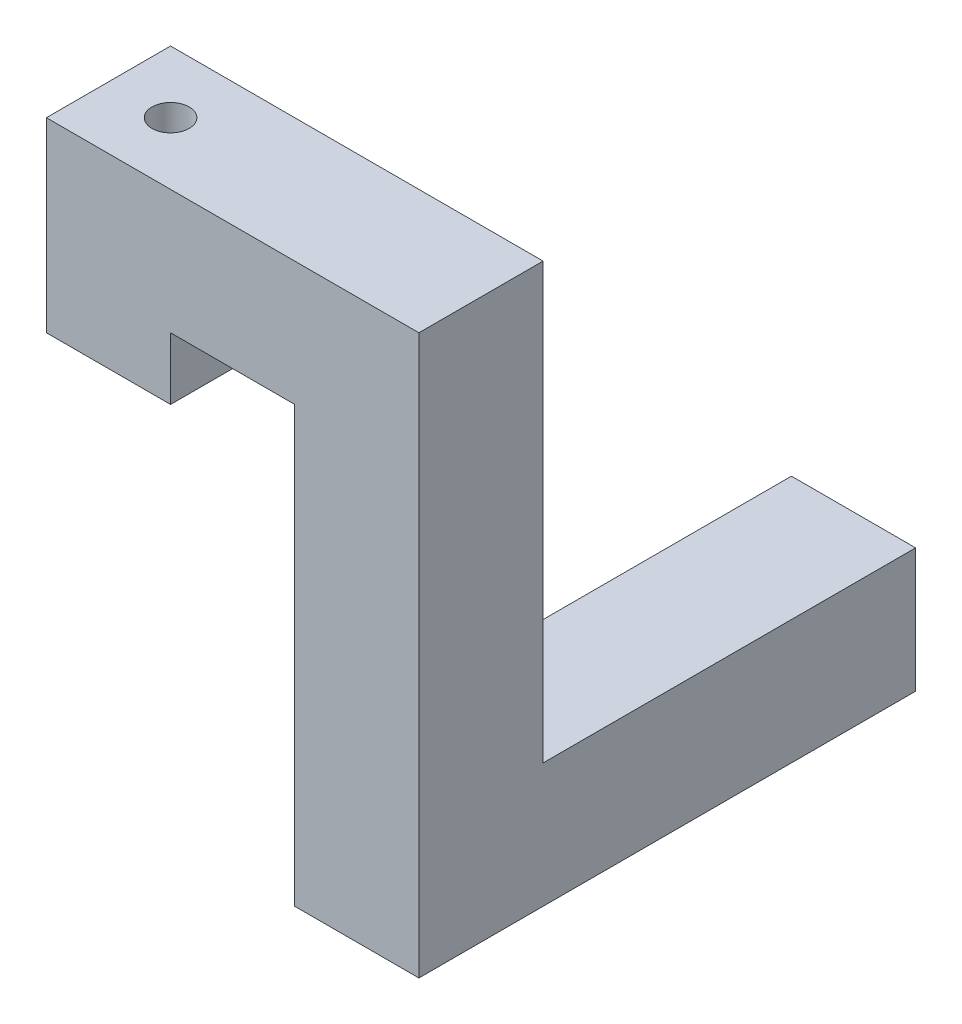
ISO-10303-21;
HEADER;
FILE_DESCRIPTION(('STEP AP214'),'2;1');
FILE_NAME('part.step','',(''),(''),'','','');
FILE_SCHEMA(('AUTOMOTIVE_DESIGN { 1 0 10303 214 1 1 1 1 }'));
ENDSEC;
DATA;
#1=APPLICATION_CONTEXT('core data for automotive mechanical design processes');
#2=APPLICATION_PROTOCOL_DEFINITION('international standard','automotive_design',2000,#1);
#3=PRODUCT_CONTEXT('',#1,'mechanical');
#4=PRODUCT('Part','Part','',(#3));
#5=PRODUCT_RELATED_PRODUCT_CATEGORY('part','',(#4));
#6=PRODUCT_DEFINITION_FORMATION('','',#4);
#7=PRODUCT_DEFINITION_CONTEXT('part definition',#1,'design');
#8=PRODUCT_DEFINITION('design','',#6,#7);
#9=PRODUCT_DEFINITION_SHAPE('','',#8);
#10=(LENGTH_UNIT() NAMED_UNIT(*) SI_UNIT(.MILLI.,.METRE.));
#11=(NAMED_UNIT(*) PLANE_ANGLE_UNIT() SI_UNIT($,.RADIAN.));
#12=(NAMED_UNIT(*) SI_UNIT($,.STERADIAN.) SOLID_ANGLE_UNIT());
#13=UNCERTAINTY_MEASURE_WITH_UNIT(LENGTH_MEASURE(1.E-05),#10,'distance_accuracy_value','');
#14=(GEOMETRIC_REPRESENTATION_CONTEXT(3) GLOBAL_UNCERTAINTY_ASSIGNED_CONTEXT((#13)) GLOBAL_UNIT_ASSIGNED_CONTEXT((#10,
#11,#12)) REPRESENTATION_CONTEXT('',''));
#15=CARTESIAN_POINT('',(0.,0.,0.));
#16=DIRECTION('',(0.,0.,1.));
#17=DIRECTION('',(1.,0.,0.));
#18=AXIS2_PLACEMENT_3D('',#15,#16,#17);
#19=CARTESIAN_POINT('',(-10.,30.,-9.99999999999999));
#20=DIRECTION('',(0.,0.,1.));
#21=DIRECTION('',(1.,0.,0.));
#22=AXIS2_PLACEMENT_3D('',#19,#20,#21);
#23=PLANE('',#22);
#24=DIRECTION('',(1.,0.,0.));
#25=VECTOR('',#24,1.);
#26=CARTESIAN_POINT('',(30.,-40.,-9.99999999999999));
#27=LINE('',#26,#25);
#28=CARTESIAN_POINT('',(30.,-40.,-9.99999999999999));
#29=VERTEX_POINT('',#28);
#30=CARTESIAN_POINT('',(50.,-40.,-9.99999999999999));
#31=VERTEX_POINT('',#30);
#32=EDGE_CURVE('E55',#29,#31,#27,.T.);
#33=ORIENTED_EDGE('',*,*,#32,.F.);
#34=DIRECTION('',(0.,1.,0.));
#35=VECTOR('',#34,1.);
#36=CARTESIAN_POINT('',(30.,-60.,-9.99999999999999));
#37=LINE('',#36,#35);
#38=CARTESIAN_POINT('',(30.,10.,-9.99999999999999));
#39=VERTEX_POINT('',#38);
#40=EDGE_CURVE('E143',#29,#39,#37,.T.);
#41=ORIENTED_EDGE('',*,*,#40,.T.);
#42=DIRECTION('',(-1.,0.,0.));
#43=VECTOR('',#42,1.);
#44=CARTESIAN_POINT('',(50.,10.,-9.99999999999999));
#45=LINE('',#44,#43);
#46=CARTESIAN_POINT('',(9.99999999999999,10.,-9.99999999999999));
#47=VERTEX_POINT('',#46);
#48=EDGE_CURVE('E182',#39,#47,#45,.T.);
#49=ORIENTED_EDGE('',*,*,#48,.T.);
#50=DIRECTION('',(0.,-1.,0.));
#51=VECTOR('',#50,1.);
#52=CARTESIAN_POINT('',(9.99999999999999,30.,-9.99999999999999));
#53=LINE('',#52,#51);
#54=CARTESIAN_POINT('',(9.99999999999999,0.,-9.99999999999999));
#55=VERTEX_POINT('',#54);
#56=EDGE_CURVE('E11',#47,#55,#53,.T.);
#57=ORIENTED_EDGE('',*,*,#56,.T.);
#58=DIRECTION('',(-1.,0.,0.));
#59=VECTOR('',#58,1.);
#60=CARTESIAN_POINT('',(-10.,0.,-9.99999999999999));
#61=LINE('',#60,#59);
#62=CARTESIAN_POINT('',(-10.,0.,-9.99999999999999));
#63=VERTEX_POINT('',#62);
#64=EDGE_CURVE('E200',#55,#63,#61,.T.);
#65=ORIENTED_EDGE('',*,*,#64,.T.);
#66=DIRECTION('',(0.,-1.,0.));
#67=VECTOR('',#66,1.);
#68=CARTESIAN_POINT('',(-10.,30.,-9.99999999999999));
#69=LINE('',#68,#67);
#70=CARTESIAN_POINT('',(-10.,30.,-9.99999999999999));
#71=VERTEX_POINT('',#70);
#72=EDGE_CURVE('E48',#71,#63,#69,.T.);
#73=ORIENTED_EDGE('',*,*,#72,.F.);
#74=DIRECTION('',(-1.,0.,0.));
#75=VECTOR('',#74,1.);
#76=CARTESIAN_POINT('',(-10.,30.,-9.99999999999999));
#77=LINE('',#76,#75);
#78=CARTESIAN_POINT('',(50.,30.,-9.99999999999999));
#79=VERTEX_POINT('',#78);
#80=EDGE_CURVE('E186',#79,#71,#77,.T.);
#81=ORIENTED_EDGE('',*,*,#80,.F.);
#82=DIRECTION('',(0.,-1.,0.));
#83=VECTOR('',#82,1.);
#84=CARTESIAN_POINT('',(50.,30.,-9.99999999999999));
#85=LINE('',#84,#83);
#86=EDGE_CURVE('E168',#79,#31,#85,.T.);
#87=ORIENTED_EDGE('',*,*,#86,.T.);
#88=EDGE_LOOP('',(#33,#41,#49,#57,#65,#73,#81,#87));
#89=FACE_BOUND('',#88,.T.);
#90=ADVANCED_FACE('F39',(#89),#23,.F.);
#91=CARTESIAN_POINT('',(50.,10.,10.));
#92=DIRECTION('',(0.,1.,0.));
#93=DIRECTION('',(0.,0.,1.));
#94=AXIS2_PLACEMENT_3D('',#91,#92,#93);
#95=PLANE('',#94);
#96=DIRECTION('',(0.,0.,-1.));
#97=VECTOR('',#96,1.);
#98=CARTESIAN_POINT('',(30.,10.,10.));
#99=LINE('',#98,#97);
#100=CARTESIAN_POINT('',(30.,10.,10.));
#101=VERTEX_POINT('',#100);
#102=EDGE_CURVE('E145',#101,#39,#99,.T.);
#103=ORIENTED_EDGE('',*,*,#102,.F.);
#104=DIRECTION('',(-1.,0.,0.));
#105=VECTOR('',#104,1.);
#106=CARTESIAN_POINT('',(50.,10.,10.));
#107=LINE('',#106,#105);
#108=CARTESIAN_POINT('',(10.,10.,10.));
#109=VERTEX_POINT('',#108);
#110=EDGE_CURVE('E63',#101,#109,#107,.T.);
#111=ORIENTED_EDGE('',*,*,#110,.T.);
#112=DIRECTION('',(0.,0.,-1.));
#113=VECTOR('',#112,1.);
#114=CARTESIAN_POINT('',(10.,10.,10.));
#115=LINE('',#114,#113);
#116=EDGE_CURVE('E165',#109,#47,#115,.T.);
#117=ORIENTED_EDGE('',*,*,#116,.T.);
#118=ORIENTED_EDGE('',*,*,#48,.F.);
#119=EDGE_LOOP('',(#103,#111,#117,#118));
#120=FACE_BOUND('',#119,.T.);
#121=ADVANCED_FACE('F270',(#120),#95,.F.);
#122=CARTESIAN_POINT('',(9.99999999999999,30.,-9.99999999999999));
#123=DIRECTION('',(-1.,0.,0.));
#124=DIRECTION('',(0.,0.,1.));
#125=AXIS2_PLACEMENT_3D('',#122,#123,#124);
#126=PLANE('',#125);
#127=ORIENTED_EDGE('',*,*,#116,.F.);
#128=DIRECTION('',(0.,-1.,0.));
#129=VECTOR('',#128,1.);
#130=CARTESIAN_POINT('',(10.,30.,10.));
#131=LINE('',#130,#129);
#132=CARTESIAN_POINT('',(10.,0.,10.));
#133=VERTEX_POINT('',#132);
#134=EDGE_CURVE('E196',#109,#133,#131,.T.);
#135=ORIENTED_EDGE('',*,*,#134,.T.);
#136=DIRECTION('',(0.,0.,-1.));
#137=VECTOR('',#136,1.);
#138=CARTESIAN_POINT('',(9.99999999999999,0.,-9.99999999999999));
#139=LINE('',#138,#137);
#140=EDGE_CURVE('E185',#133,#55,#139,.T.);
#141=ORIENTED_EDGE('',*,*,#140,.T.);
#142=ORIENTED_EDGE('',*,*,#56,.F.);
#143=EDGE_LOOP('',(#127,#135,#141,#142));
#144=FACE_BOUND('',#143,.T.);
#145=ADVANCED_FACE('F41',(#144),#126,.F.);
#146=CARTESIAN_POINT('',(-10.,30.,-9.99999999999999));
#147=DIRECTION('',(1.,0.,0.));
#148=DIRECTION('',(0.,0.,-1.));
#149=AXIS2_PLACEMENT_3D('',#146,#147,#148);
#150=PLANE('',#149);
#151=DIRECTION('',(0.,0.,1.));
#152=VECTOR('',#151,1.);
#153=CARTESIAN_POINT('',(-10.,0.,-9.99999999999999));
#154=LINE('',#153,#152);
#155=CARTESIAN_POINT('',(-10.,0.,10.));
#156=VERTEX_POINT('',#155);
#157=EDGE_CURVE('E203',#63,#156,#154,.T.);
#158=ORIENTED_EDGE('',*,*,#157,.T.);
#159=DIRECTION('',(0.,-1.,0.));
#160=VECTOR('',#159,1.);
#161=CARTESIAN_POINT('',(-10.,30.,10.));
#162=LINE('',#161,#160);
#163=CARTESIAN_POINT('',(-10.,30.,10.));
#164=VERTEX_POINT('',#163);
#165=EDGE_CURVE('E211',#164,#156,#162,.T.);
#166=ORIENTED_EDGE('',*,*,#165,.F.);
#167=DIRECTION('',(0.,0.,1.));
#168=VECTOR('',#167,1.);
#169=CARTESIAN_POINT('',(-10.,30.,-9.99999999999999));
#170=LINE('',#169,#168);
#171=EDGE_CURVE('E189',#71,#164,#170,.T.);
#172=ORIENTED_EDGE('',*,*,#171,.F.);
#173=ORIENTED_EDGE('',*,*,#72,.T.);
#174=EDGE_LOOP('',(#158,#166,#172,#173));
#175=FACE_BOUND('',#174,.T.);
#176=ADVANCED_FACE('F220',(#175),#150,.F.);
#177=CARTESIAN_POINT('',(-10.,30.,10.));
#178=DIRECTION('',(0.,0.,-1.));
#179=DIRECTION('',(-1.,0.,0.));
#180=AXIS2_PLACEMENT_3D('',#177,#178,#179);
#181=PLANE('',#180);
#182=DIRECTION('',(1.,0.,0.));
#183=VECTOR('',#182,1.);
#184=CARTESIAN_POINT('',(-10.,0.,10.));
#185=LINE('',#184,#183);
#186=EDGE_CURVE('E190',#156,#133,#185,.T.);
#187=ORIENTED_EDGE('',*,*,#186,.T.);
#188=ORIENTED_EDGE('',*,*,#134,.F.);
#189=ORIENTED_EDGE('',*,*,#110,.F.);
#190=DIRECTION('',(0.,1.,0.));
#191=VECTOR('',#190,1.);
#192=CARTESIAN_POINT('',(30.,-60.,10.));
#193=LINE('',#192,#191);
#194=CARTESIAN_POINT('',(30.,-60.,10.));
#195=VERTEX_POINT('',#194);
#196=EDGE_CURVE('E162',#195,#101,#193,.T.);
#197=ORIENTED_EDGE('',*,*,#196,.F.);
#198=DIRECTION('',(-1.,0.,0.));
#199=VECTOR('',#198,1.);
#200=CARTESIAN_POINT('',(50.,-60.,10.));
#201=LINE('',#200,#199);
#202=CARTESIAN_POINT('',(50.,-60.,10.));
#203=VERTEX_POINT('',#202);
#204=EDGE_CURVE('E156',#203,#195,#201,.T.);
#205=ORIENTED_EDGE('',*,*,#204,.F.);
#206=DIRECTION('',(0.,-1.,0.));
#207=VECTOR('',#206,1.);
#208=CARTESIAN_POINT('',(50.,30.,10.));
#209=LINE('',#208,#207);
#210=CARTESIAN_POINT('',(50.,30.,10.));
#211=VERTEX_POINT('',#210);
#212=EDGE_CURVE('E175',#211,#203,#209,.T.);
#213=ORIENTED_EDGE('',*,*,#212,.F.);
#214=DIRECTION('',(1.,0.,0.));
#215=VECTOR('',#214,1.);
#216=CARTESIAN_POINT('',(-10.,30.,10.));
#217=LINE('',#216,#215);
#218=EDGE_CURVE('E193',#164,#211,#217,.T.);
#219=ORIENTED_EDGE('',*,*,#218,.F.);
#220=ORIENTED_EDGE('',*,*,#165,.T.);
#221=EDGE_LOOP('',(#187,#188,#189,#197,#205,#213,#219,#220));
#222=FACE_BOUND('',#221,.T.);
#223=ADVANCED_FACE('F229',(#222),#181,.F.);
#224=CARTESIAN_POINT('',(0.,30.,0.));
#225=DIRECTION('',(0.,1.,0.));
#226=DIRECTION('',(0.,0.,1.));
#227=AXIS2_PLACEMENT_3D('',#224,#225,#226);
#228=PLANE('',#227);
#229=CARTESIAN_POINT('',(0.,30.,0.));
#230=DIRECTION('',(0.,1.,0.));
#231=DIRECTION('',(0.,0.,1.));
#232=AXIS2_PLACEMENT_3D('',#229,#230,#231);
#233=CIRCLE('',#232,3.);
#234=CARTESIAN_POINT('',(0.,30.,3.));
#235=VERTEX_POINT('',#234);
#236=EDGE_CURVE('E245',#235,#235,#233,.T.);
#237=ORIENTED_EDGE('',*,*,#236,.F.);
#238=EDGE_LOOP('',(#237));
#239=FACE_BOUND('',#238,.T.);
#240=ORIENTED_EDGE('',*,*,#218,.T.);
#241=DIRECTION('',(0.,0.,-1.));
#242=VECTOR('',#241,1.);
#243=CARTESIAN_POINT('',(50.,30.,10.));
#244=LINE('',#243,#242);
#245=EDGE_CURVE('E171',#211,#79,#244,.T.);
#246=ORIENTED_EDGE('',*,*,#245,.T.);
#247=ORIENTED_EDGE('',*,*,#80,.T.);
#248=ORIENTED_EDGE('',*,*,#171,.T.);
#249=EDGE_LOOP('',(#240,#246,#247,#248));
#250=FACE_BOUND('',#249,.T.);
#251=ADVANCED_FACE('F235',(#239,#250),#228,.T.);
#252=CARTESIAN_POINT('',(0.,0.,0.));
#253=DIRECTION('',(0.,1.,0.));
#254=DIRECTION('',(0.,0.,1.));
#255=AXIS2_PLACEMENT_3D('',#252,#253,#254);
#256=PLANE('',#255);
#257=CARTESIAN_POINT('',(0.,0.,0.));
#258=DIRECTION('',(0.,-1.,0.));
#259=DIRECTION('',(0.,0.,-1.));
#260=AXIS2_PLACEMENT_3D('',#257,#258,#259);
#261=CIRCLE('',#260,3.);
#262=CARTESIAN_POINT('',(0.,0.,-3.));
#263=VERTEX_POINT('',#262);
#264=EDGE_CURVE('E248',#263,#263,#261,.T.);
#265=ORIENTED_EDGE('',*,*,#264,.F.);
#266=EDGE_LOOP('',(#265));
#267=FACE_BOUND('',#266,.T.);
#268=ORIENTED_EDGE('',*,*,#140,.F.);
#269=ORIENTED_EDGE('',*,*,#186,.F.);
#270=ORIENTED_EDGE('',*,*,#157,.F.);
#271=ORIENTED_EDGE('',*,*,#64,.F.);
#272=EDGE_LOOP('',(#268,#269,#270,#271));
#273=FACE_BOUND('',#272,.T.);
#274=ADVANCED_FACE('F226',(#267,#273),#256,.F.);
#275=CARTESIAN_POINT('',(50.,0.,0.));
#276=DIRECTION('',(-1.,0.,0.));
#277=DIRECTION('',(0.,0.,1.));
#278=AXIS2_PLACEMENT_3D('',#275,#276,#277);
#279=PLANE('',#278);
#280=ORIENTED_EDGE('',*,*,#212,.T.);
#281=DIRECTION('',(0.,0.,-1.));
#282=VECTOR('',#281,1.);
#283=CARTESIAN_POINT('',(50.,-60.,10.));
#284=LINE('',#283,#282);
#285=CARTESIAN_POINT('',(50.,-60.,-70.));
#286=VERTEX_POINT('',#285);
#287=EDGE_CURVE('E159',#203,#286,#284,.T.);
#288=ORIENTED_EDGE('',*,*,#287,.T.);
#289=DIRECTION('',(0.,-1.,0.));
#290=VECTOR('',#289,1.);
#291=CARTESIAN_POINT('',(50.,-60.,-70.));
#292=LINE('',#291,#290);
#293=CARTESIAN_POINT('',(50.,-40.,-70.));
#294=VERTEX_POINT('',#293);
#295=EDGE_CURVE('E129',#294,#286,#292,.T.);
#296=ORIENTED_EDGE('',*,*,#295,.F.);
#297=DIRECTION('',(0.,0.,1.));
#298=VECTOR('',#297,1.);
#299=CARTESIAN_POINT('',(50.,-40.,-70.));
#300=LINE('',#299,#298);
#301=EDGE_CURVE('E124',#294,#31,#300,.T.);
#302=ORIENTED_EDGE('',*,*,#301,.T.);
#303=ORIENTED_EDGE('',*,*,#86,.F.);
#304=ORIENTED_EDGE('',*,*,#245,.F.);
#305=EDGE_LOOP('',(#280,#288,#296,#302,#303,#304));
#306=FACE_BOUND('',#305,.T.);
#307=ADVANCED_FACE('F238',(#306),#279,.F.);
#308=CARTESIAN_POINT('',(30.,-60.,10.));
#309=DIRECTION('',(1.,0.,0.));
#310=DIRECTION('',(0.,0.,-1.));
#311=AXIS2_PLACEMENT_3D('',#308,#309,#310);
#312=PLANE('',#311);
#313=ORIENTED_EDGE('',*,*,#102,.T.);
#314=ORIENTED_EDGE('',*,*,#40,.F.);
#315=DIRECTION('',(0.,0.,1.));
#316=VECTOR('',#315,1.);
#317=CARTESIAN_POINT('',(30.,-40.,-70.));
#318=LINE('',#317,#316);
#319=CARTESIAN_POINT('',(30.,-40.,-70.));
#320=VERTEX_POINT('',#319);
#321=EDGE_CURVE('E122',#320,#29,#318,.T.);
#322=ORIENTED_EDGE('',*,*,#321,.F.);
#323=DIRECTION('',(0.,1.,0.));
#324=VECTOR('',#323,1.);
#325=CARTESIAN_POINT('',(30.,-60.,-70.));
#326=LINE('',#325,#324);
#327=CARTESIAN_POINT('',(30.,-60.,-70.));
#328=VERTEX_POINT('',#327);
#329=EDGE_CURVE('E130',#328,#320,#326,.T.);
#330=ORIENTED_EDGE('',*,*,#329,.F.);
#331=DIRECTION('',(0.,0.,-1.));
#332=VECTOR('',#331,1.);
#333=CARTESIAN_POINT('',(30.,-60.,10.));
#334=LINE('',#333,#332);
#335=EDGE_CURVE('E149',#195,#328,#334,.T.);
#336=ORIENTED_EDGE('',*,*,#335,.F.);
#337=ORIENTED_EDGE('',*,*,#196,.T.);
#338=EDGE_LOOP('',(#313,#314,#322,#330,#336,#337));
#339=FACE_BOUND('',#338,.T.);
#340=ADVANCED_FACE('F142',(#339),#312,.F.);
#341=CARTESIAN_POINT('',(0.,-60.,0.));
#342=DIRECTION('',(0.,-1.,0.));
#343=DIRECTION('',(0.,0.,-1.));
#344=AXIS2_PLACEMENT_3D('',#341,#342,#343);
#345=PLANE('',#344);
#346=ORIENTED_EDGE('',*,*,#335,.T.);
#347=DIRECTION('',(-1.,0.,0.));
#348=VECTOR('',#347,1.);
#349=CARTESIAN_POINT('',(30.,-60.,-70.));
#350=LINE('',#349,#348);
#351=EDGE_CURVE('E136',#286,#328,#350,.T.);
#352=ORIENTED_EDGE('',*,*,#351,.F.);
#353=ORIENTED_EDGE('',*,*,#287,.F.);
#354=ORIENTED_EDGE('',*,*,#204,.T.);
#355=EDGE_LOOP('',(#346,#352,#353,#354));
#356=FACE_BOUND('',#355,.T.);
#357=ADVANCED_FACE('F318',(#356),#345,.T.);
#358=CARTESIAN_POINT('',(30.,-40.,-70.));
#359=DIRECTION('',(0.,-1.,0.));
#360=DIRECTION('',(0.,0.,-1.));
#361=AXIS2_PLACEMENT_3D('',#358,#359,#360);
#362=PLANE('',#361);
#363=ORIENTED_EDGE('',*,*,#32,.T.);
#364=ORIENTED_EDGE('',*,*,#301,.F.);
#365=DIRECTION('',(1.,0.,0.));
#366=VECTOR('',#365,1.);
#367=CARTESIAN_POINT('',(30.,-40.,-70.));
#368=LINE('',#367,#366);
#369=EDGE_CURVE('E118',#320,#294,#368,.T.);
#370=ORIENTED_EDGE('',*,*,#369,.F.);
#371=ORIENTED_EDGE('',*,*,#321,.T.);
#372=EDGE_LOOP('',(#363,#364,#370,#371));
#373=FACE_BOUND('',#372,.T.);
#374=ADVANCED_FACE('F120',(#373),#362,.F.);
#375=CARTESIAN_POINT('',(0.,0.,-70.));
#376=DIRECTION('',(0.,0.,-1.));
#377=DIRECTION('',(-1.,0.,0.));
#378=AXIS2_PLACEMENT_3D('',#375,#376,#377);
#379=PLANE('',#378);
#380=ORIENTED_EDGE('',*,*,#329,.T.);
#381=ORIENTED_EDGE('',*,*,#369,.T.);
#382=ORIENTED_EDGE('',*,*,#295,.T.);
#383=ORIENTED_EDGE('',*,*,#351,.T.);
#384=EDGE_LOOP('',(#380,#381,#382,#383));
#385=FACE_BOUND('',#384,.T.);
#386=ADVANCED_FACE('F134',(#385),#379,.T.);
#387=CARTESIAN_POINT('',(0.,60.,0.));
#388=DIRECTION('',(0.,-1.,0.));
#389=DIRECTION('',(0.,0.,-1.));
#390=AXIS2_PLACEMENT_3D('',#387,#388,#389);
#391=CYLINDRICAL_SURFACE('',#390,3.);
#392=ORIENTED_EDGE('',*,*,#236,.T.);
#393=EDGE_LOOP('',(#392));
#394=FACE_BOUND('',#393,.T.);
#395=ORIENTED_EDGE('',*,*,#264,.T.);
#396=EDGE_LOOP('',(#395));
#397=FACE_BOUND('',#396,.T.);
#398=ADVANCED_FACE('F257',(#394,#397),#391,.F.);
#399=CLOSED_SHELL('',(#90,#121,#145,#176,#223,#251,#274,#307,#340,#357,#374,#386,#398));
#400=MANIFOLD_SOLID_BREP('B2',#399);
#401=ADVANCED_BREP_SHAPE_REPRESENTATION('',(#18,#400),#14);
#402=SHAPE_DEFINITION_REPRESENTATION(#9,#401);
ENDSEC;
END-ISO-10303-21;
